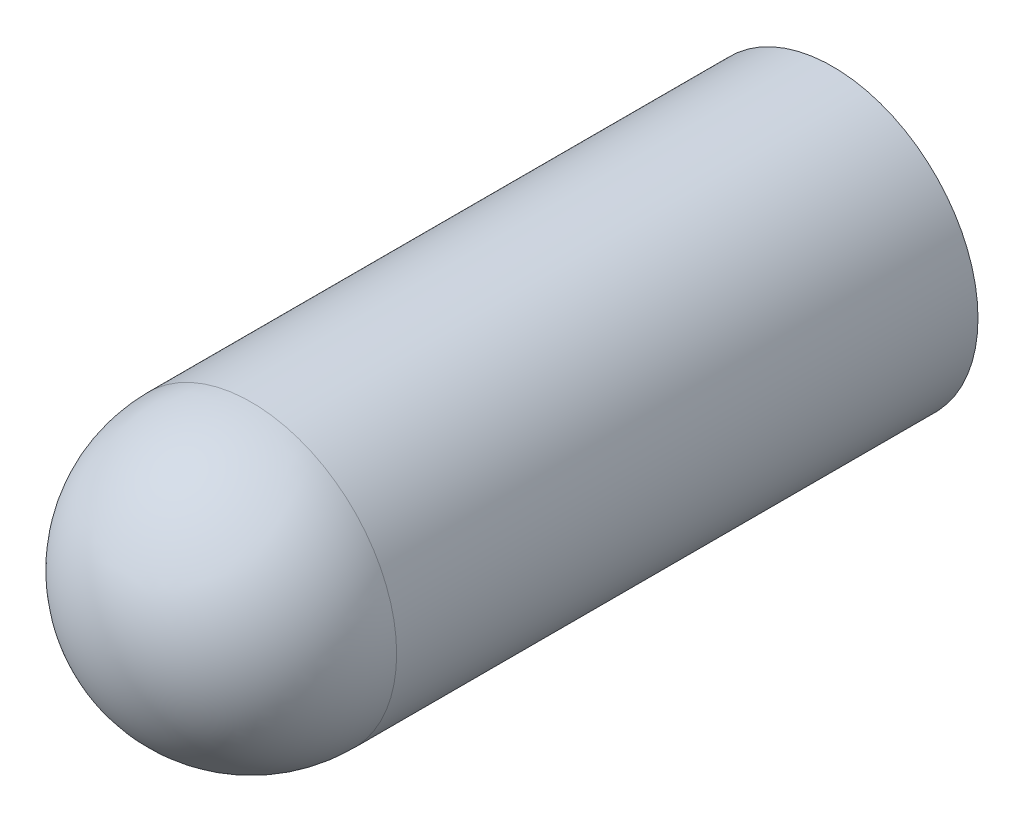
ISO-10303-21;
HEADER;
FILE_DESCRIPTION(('STEP AP214'),'2;1');
FILE_NAME('part.step','',(''),(''),'','','');
FILE_SCHEMA(('AUTOMOTIVE_DESIGN { 1 0 10303 214 1 1 1 1 }'));
ENDSEC;
DATA;
#1=APPLICATION_CONTEXT('core data for automotive mechanical design processes');
#2=APPLICATION_PROTOCOL_DEFINITION('international standard','automotive_design',2000,#1);
#3=PRODUCT_CONTEXT('',#1,'mechanical');
#4=PRODUCT('Part','Part','',(#3));
#5=PRODUCT_RELATED_PRODUCT_CATEGORY('part','',(#4));
#6=PRODUCT_DEFINITION_FORMATION('','',#4);
#7=PRODUCT_DEFINITION_CONTEXT('part definition',#1,'design');
#8=PRODUCT_DEFINITION('design','',#6,#7);
#9=PRODUCT_DEFINITION_SHAPE('','',#8);
#10=(LENGTH_UNIT() NAMED_UNIT(*) SI_UNIT(.MILLI.,.METRE.));
#11=(NAMED_UNIT(*) PLANE_ANGLE_UNIT() SI_UNIT($,.RADIAN.));
#12=(NAMED_UNIT(*) SI_UNIT($,.STERADIAN.) SOLID_ANGLE_UNIT());
#13=UNCERTAINTY_MEASURE_WITH_UNIT(LENGTH_MEASURE(1.E-05),#10,'distance_accuracy_value','');
#14=(GEOMETRIC_REPRESENTATION_CONTEXT(3) GLOBAL_UNCERTAINTY_ASSIGNED_CONTEXT((#13)) GLOBAL_UNIT_ASSIGNED_CONTEXT((#10,
#11,#12)) REPRESENTATION_CONTEXT('',''));
#15=CARTESIAN_POINT('',(0.,0.,0.));
#16=DIRECTION('',(0.,0.,1.));
#17=DIRECTION('',(1.,0.,0.));
#18=AXIS2_PLACEMENT_3D('',#15,#16,#17);
#19=CARTESIAN_POINT('',(0.,0.,62.5));
#20=DIRECTION('',(0.,0.,-1.));
#21=DIRECTION('',(-1.,0.,0.));
#22=AXIS2_PLACEMENT_3D('',#19,#20,#21);
#23=CYLINDRICAL_SURFACE('',#22,12.5);
#24=CARTESIAN_POINT('',(0.,0.,50.));
#25=DIRECTION('',(0.,0.,-1.));
#26=DIRECTION('',(-1.,0.,0.));
#27=AXIS2_PLACEMENT_3D('',#24,#25,#26);
#28=CIRCLE('',#27,12.5);
#29=CARTESIAN_POINT('',(-12.5,0.,50.));
#30=VERTEX_POINT('',#29);
#31=EDGE_CURVE('E10',#30,#30,#28,.T.);
#32=ORIENTED_EDGE('',*,*,#31,.T.);
#33=EDGE_LOOP('',(#32));
#34=FACE_BOUND('',#33,.T.);
#35=CARTESIAN_POINT('',(0.,0.,0.));
#36=DIRECTION('',(0.,0.,1.));
#37=DIRECTION('',(1.,0.,0.));
#38=AXIS2_PLACEMENT_3D('',#35,#36,#37);
#39=CIRCLE('',#38,12.5);
#40=CARTESIAN_POINT('',(12.5,0.,0.));
#41=VERTEX_POINT('',#40);
#42=EDGE_CURVE('E52',#41,#41,#39,.T.);
#43=ORIENTED_EDGE('',*,*,#42,.T.);
#44=EDGE_LOOP('',(#43));
#45=FACE_BOUND('',#44,.T.);
#46=ADVANCED_FACE('F43',(#34,#45),#23,.T.);
#47=CARTESIAN_POINT('',(0.,0.,0.));
#48=DIRECTION('',(0.,0.,1.));
#49=DIRECTION('',(1.,0.,0.));
#50=AXIS2_PLACEMENT_3D('',#47,#48,#49);
#51=PLANE('',#50);
#52=CARTESIAN_POINT('',(0.,0.,0.));
#53=DIRECTION('',(0.,0.,1.));
#54=DIRECTION('',(1.,0.,0.));
#55=AXIS2_PLACEMENT_3D('',#52,#53,#54);
#56=CIRCLE('',#55,10.);
#57=CARTESIAN_POINT('',(10.,0.,0.));
#58=VERTEX_POINT('',#57);
#59=EDGE_CURVE('E47',#58,#58,#56,.F.);
#60=ORIENTED_EDGE('',*,*,#59,.F.);
#61=EDGE_LOOP('',(#60));
#62=FACE_BOUND('',#61,.T.);
#63=ORIENTED_EDGE('',*,*,#42,.F.);
#64=EDGE_LOOP('',(#63));
#65=FACE_BOUND('',#64,.T.);
#66=ADVANCED_FACE('F90',(#62,#65),#51,.F.);
#67=CARTESIAN_POINT('',(0.,0.,50.));
#68=DIRECTION('',(0.,0.,1.));
#69=DIRECTION('',(1.,0.,0.));
#70=AXIS2_PLACEMENT_3D('',#67,#68,#69);
#71=SPHERICAL_SURFACE('',#70,12.5);
#72=ORIENTED_EDGE('',*,*,#31,.F.);
#73=EDGE_LOOP('',(#72));
#74=FACE_BOUND('',#73,.T.);
#75=ADVANCED_FACE('F45',(#74),#71,.T.);
#76=CARTESIAN_POINT('',(0.,0.,-1.2E-05));
#77=DIRECTION('',(0.,0.,1.));
#78=DIRECTION('',(1.,0.,0.));
#79=AXIS2_PLACEMENT_3D('',#76,#77,#78);
#80=CYLINDRICAL_SURFACE('',#79,10.);
#81=CARTESIAN_POINT('',(0.,0.,45.));
#82=DIRECTION('',(0.,0.,-1.));
#83=DIRECTION('',(-1.,0.,0.));
#84=AXIS2_PLACEMENT_3D('',#81,#82,#83);
#85=CIRCLE('',#84,10.);
#86=CARTESIAN_POINT('',(10.,0.,45.));
#87=VERTEX_POINT('',#86);
#88=EDGE_CURVE('E59',#87,#87,#85,.T.);
#89=CARTESIAN_POINT('',(10.,0.,45.));
#90=CARTESIAN_POINT('',(10.,0.,44.53125));
#91=CARTESIAN_POINT('',(10.,0.,44.0625));
#92=CARTESIAN_POINT('',(10.,0.,43.125));
#93=CARTESIAN_POINT('',(10.,0.,42.65625));
#94=CARTESIAN_POINT('',(10.,0.,41.71875));
#95=CARTESIAN_POINT('',(10.,0.,41.25));
#96=CARTESIAN_POINT('',(10.,0.,40.3125));
#97=CARTESIAN_POINT('',(10.,0.,39.84375));
#98=CARTESIAN_POINT('',(10.,0.,38.90625));
#99=CARTESIAN_POINT('',(10.,0.,38.4375));
#100=CARTESIAN_POINT('',(10.,0.,37.5));
#101=CARTESIAN_POINT('',(10.,0.,37.03125));
#102=CARTESIAN_POINT('',(10.,0.,36.09375));
#103=CARTESIAN_POINT('',(10.,0.,35.625));
#104=CARTESIAN_POINT('',(10.,0.,34.6875));
#105=CARTESIAN_POINT('',(10.,0.,34.21875));
#106=CARTESIAN_POINT('',(10.,0.,33.28125));
#107=CARTESIAN_POINT('',(10.,0.,32.8125));
#108=CARTESIAN_POINT('',(10.,0.,31.875));
#109=CARTESIAN_POINT('',(10.,0.,31.40625));
#110=CARTESIAN_POINT('',(10.,0.,30.46875));
#111=CARTESIAN_POINT('',(10.,0.,30.));
#112=CARTESIAN_POINT('',(10.,0.,29.0625));
#113=CARTESIAN_POINT('',(10.,0.,28.59375));
#114=CARTESIAN_POINT('',(10.,0.,27.65625));
#115=CARTESIAN_POINT('',(10.,0.,27.1875));
#116=CARTESIAN_POINT('',(10.,0.,26.25));
#117=CARTESIAN_POINT('',(10.,0.,25.78125));
#118=CARTESIAN_POINT('',(10.,0.,24.84375));
#119=CARTESIAN_POINT('',(10.,0.,24.375));
#120=CARTESIAN_POINT('',(10.,0.,23.4375));
#121=CARTESIAN_POINT('',(10.,0.,22.96875));
#122=CARTESIAN_POINT('',(10.,0.,22.03125));
#123=CARTESIAN_POINT('',(10.,0.,21.5625));
#124=CARTESIAN_POINT('',(10.,0.,20.625));
#125=CARTESIAN_POINT('',(10.,0.,20.15625));
#126=CARTESIAN_POINT('',(10.,0.,19.21875));
#127=CARTESIAN_POINT('',(10.,0.,18.75));
#128=CARTESIAN_POINT('',(10.,0.,17.8125));
#129=CARTESIAN_POINT('',(10.,0.,17.34375));
#130=CARTESIAN_POINT('',(10.,0.,16.40625));
#131=CARTESIAN_POINT('',(10.,0.,15.9375));
#132=CARTESIAN_POINT('',(10.,0.,15.));
#133=CARTESIAN_POINT('',(10.,0.,14.53125));
#134=CARTESIAN_POINT('',(10.,0.,13.59375));
#135=CARTESIAN_POINT('',(10.,0.,13.125));
#136=CARTESIAN_POINT('',(10.,0.,12.1875));
#137=CARTESIAN_POINT('',(10.,0.,11.71875));
#138=CARTESIAN_POINT('',(10.,0.,10.78125));
#139=CARTESIAN_POINT('',(10.,0.,10.3125));
#140=CARTESIAN_POINT('',(10.,0.,9.375));
#141=CARTESIAN_POINT('',(10.,0.,8.90625));
#142=CARTESIAN_POINT('',(10.,0.,7.96875));
#143=CARTESIAN_POINT('',(10.,0.,7.5));
#144=CARTESIAN_POINT('',(10.,0.,6.5625));
#145=CARTESIAN_POINT('',(10.,0.,6.09375));
#146=CARTESIAN_POINT('',(10.,0.,5.15625));
#147=CARTESIAN_POINT('',(10.,0.,4.6875));
#148=CARTESIAN_POINT('',(10.,0.,3.75));
#149=CARTESIAN_POINT('',(10.,0.,3.28125));
#150=CARTESIAN_POINT('',(10.,0.,2.34375));
#151=CARTESIAN_POINT('',(10.,0.,1.875));
#152=CARTESIAN_POINT('',(10.,0.,0.937499999999999));
#153=CARTESIAN_POINT('',(10.,0.,0.46875));
#154=CARTESIAN_POINT('',(10.,0.,0.));
#155=B_SPLINE_CURVE_WITH_KNOTS('',3,(#89,#90,#91,#92,#93,#94,#95,#96,#97,#98,#99,#100,#101,#102,
#103,#104,#105,#106,#107,#108,#109,#110,#111,#112,#113,#114,#115,#116,#117,#118,#119,#120,#121,
#122,#123,#124,#125,#126,#127,#128,#129,#130,#131,#132,#133,#134,#135,#136,#137,#138,#139,#140,
#141,#142,#143,#144,#145,#146,#147,#148,#149,#150,#151,#152,#153,#154),.UNSPECIFIED.,.F.,.F.,(4,
2,2,2,2,2,2,2,2,2,2,2,2,2,2,2,2,2,2,2,2,2,2,2,2,2,2,2,2,2,2,2,4),(0.,1.40625,2.8125,4.21875,
5.625,7.03125,8.4375,9.84375,11.25,12.65625,14.0625,15.46875,16.875,18.28125,19.6875,21.09375,
22.5,23.90625,25.3125,26.71875,28.125,29.53125,30.9375,32.34375,33.75,35.15625,36.5625,37.96875,
39.375,40.78125,42.1875,43.59375,45.),.UNSPECIFIED.);
#156=EDGE_CURVE('BSEAM77',#87,#58,#155,.T.);
#157=ORIENTED_EDGE('',*,*,#88,.F.);
#158=ORIENTED_EDGE('',*,*,#59,.T.);
#159=ORIENTED_EDGE('',*,*,#156,.T.);
#160=ORIENTED_EDGE('',*,*,#156,.F.);
#161=EDGE_LOOP('',(#157,#159,#158,#160));
#162=FACE_BOUND('',#161,.T.);
#163=ADVANCED_FACE('F77',(#162),#80,.F.);
#164=CARTESIAN_POINT('',(0.,0.,50.));
#165=DIRECTION('',(0.,0.,-1.));
#166=DIRECTION('',(-1.,0.,0.));
#167=AXIS2_PLACEMENT_3D('',#164,#165,#166);
#168=CYLINDRICAL_SURFACE('',#167,10.5);
#169=CARTESIAN_POINT('',(0.,0.,50.));
#170=DIRECTION('',(0.,0.,-1.));
#171=DIRECTION('',(-1.,0.,0.));
#172=AXIS2_PLACEMENT_3D('',#169,#170,#171);
#173=CIRCLE('',#172,10.5);
#174=CARTESIAN_POINT('',(-10.5,0.,50.));
#175=VERTEX_POINT('',#174);
#176=EDGE_CURVE('E63',#175,#175,#173,.T.);
#177=ORIENTED_EDGE('',*,*,#176,.F.);
#178=EDGE_LOOP('',(#177));
#179=FACE_BOUND('',#178,.T.);
#180=CARTESIAN_POINT('',(0.,0.,45.));
#181=DIRECTION('',(0.,0.,-1.));
#182=DIRECTION('',(-1.,0.,0.));
#183=AXIS2_PLACEMENT_3D('',#180,#181,#182);
#184=CIRCLE('',#183,10.5);
#185=CARTESIAN_POINT('',(-10.5,0.,45.));
#186=VERTEX_POINT('',#185);
#187=EDGE_CURVE('E64',#186,#186,#184,.T.);
#188=ORIENTED_EDGE('',*,*,#187,.T.);
#189=EDGE_LOOP('',(#188));
#190=FACE_BOUND('',#189,.T.);
#191=ADVANCED_FACE('F74',(#179,#190),#168,.F.);
#192=CARTESIAN_POINT('',(0.,0.,50.));
#193=DIRECTION('',(0.,0.,-1.));
#194=DIRECTION('',(-1.,0.,0.));
#195=AXIS2_PLACEMENT_3D('',#192,#193,#194);
#196=PLANE('',#195);
#197=ORIENTED_EDGE('',*,*,#176,.T.);
#198=EDGE_LOOP('',(#197));
#199=FACE_BOUND('',#198,.T.);
#200=ADVANCED_FACE('F72',(#199),#196,.T.);
#201=CARTESIAN_POINT('',(0.,0.,45.));
#202=DIRECTION('',(0.,0.,-1.));
#203=DIRECTION('',(-1.,0.,0.));
#204=AXIS2_PLACEMENT_3D('',#201,#202,#203);
#205=PLANE('',#204);
#206=ORIENTED_EDGE('',*,*,#88,.T.);
#207=EDGE_LOOP('',(#206));
#208=FACE_BOUND('',#207,.T.);
#209=ORIENTED_EDGE('',*,*,#187,.F.);
#210=EDGE_LOOP('',(#209));
#211=FACE_BOUND('',#210,.T.);
#212=ADVANCED_FACE('F81',(#208,#211),#205,.F.);
#213=CLOSED_SHELL('',(#46,#66,#75,#163,#191,#200,#212));
#214=MANIFOLD_SOLID_BREP('B2',#213);
#215=ADVANCED_BREP_SHAPE_REPRESENTATION('',(#18,#214),#14);
#216=SHAPE_DEFINITION_REPRESENTATION(#9,#215);
ENDSEC;
END-ISO-10303-21;
